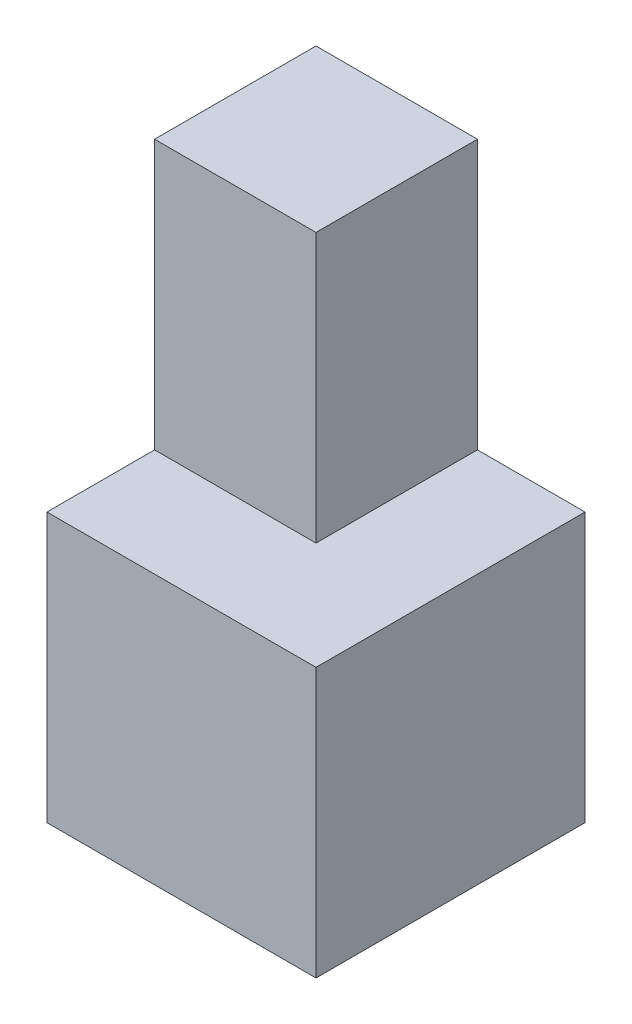
ISO-10303-21;
HEADER;
FILE_DESCRIPTION(('STEP AP214'),'2;1');
FILE_NAME('part.step','',(''),(''),'','','');
FILE_SCHEMA(('AUTOMOTIVE_DESIGN { 1 0 10303 214 1 1 1 1 }'));
ENDSEC;
DATA;
#1=APPLICATION_CONTEXT('core data for automotive mechanical design processes');
#2=APPLICATION_PROTOCOL_DEFINITION('international standard','automotive_design',2000,#1);
#3=PRODUCT_CONTEXT('',#1,'mechanical');
#4=PRODUCT('Part','Part','',(#3));
#5=PRODUCT_RELATED_PRODUCT_CATEGORY('part','',(#4));
#6=PRODUCT_DEFINITION_FORMATION('','',#4);
#7=PRODUCT_DEFINITION_CONTEXT('part definition',#1,'design');
#8=PRODUCT_DEFINITION('design','',#6,#7);
#9=PRODUCT_DEFINITION_SHAPE('','',#8);
#10=(LENGTH_UNIT() NAMED_UNIT(*) SI_UNIT(.MILLI.,.METRE.));
#11=(NAMED_UNIT(*) PLANE_ANGLE_UNIT() SI_UNIT($,.RADIAN.));
#12=(NAMED_UNIT(*) SI_UNIT($,.STERADIAN.) SOLID_ANGLE_UNIT());
#13=UNCERTAINTY_MEASURE_WITH_UNIT(LENGTH_MEASURE(1.E-05),#10,'distance_accuracy_value','');
#14=(GEOMETRIC_REPRESENTATION_CONTEXT(3) GLOBAL_UNCERTAINTY_ASSIGNED_CONTEXT((#13)) GLOBAL_UNIT_ASSIGNED_CONTEXT((#10,
#11,#12)) REPRESENTATION_CONTEXT('',''));
#15=CARTESIAN_POINT('',(0.,0.,0.));
#16=DIRECTION('',(0.,0.,1.));
#17=DIRECTION('',(1.,0.,0.));
#18=AXIS2_PLACEMENT_3D('',#15,#16,#17);
#19=CARTESIAN_POINT('',(0.,0.,0.));
#20=DIRECTION('',(0.,1.,0.));
#21=DIRECTION('',(0.,0.,1.));
#22=AXIS2_PLACEMENT_3D('',#19,#20,#21);
#23=PLANE('',#22);
#24=DIRECTION('',(1.,0.,0.));
#25=VECTOR('',#24,1.);
#26=CARTESIAN_POINT('',(0.,0.,-800.));
#27=LINE('',#26,#25);
#28=CARTESIAN_POINT('',(-200.,0.,-800.));
#29=VERTEX_POINT('',#28);
#30=CARTESIAN_POINT('',(200.,0.,-800.));
#31=VERTEX_POINT('',#30);
#32=EDGE_CURVE('E58',#29,#31,#27,.T.);
#33=ORIENTED_EDGE('',*,*,#32,.F.);
#34=DIRECTION('',(0.,0.,1.));
#35=VECTOR('',#34,1.);
#36=CARTESIAN_POINT('',(-200.,0.,0.));
#37=LINE('',#36,#35);
#38=CARTESIAN_POINT('',(-200.,0.,-200.));
#39=VERTEX_POINT('',#38);
#40=EDGE_CURVE('E100',#29,#39,#37,.T.);
#41=ORIENTED_EDGE('',*,*,#40,.T.);
#42=DIRECTION('',(1.,0.,0.));
#43=VECTOR('',#42,1.);
#44=CARTESIAN_POINT('',(0.,0.,-200.));
#45=LINE('',#44,#43);
#46=CARTESIAN_POINT('',(-800.,0.,-200.));
#47=VERTEX_POINT('',#46);
#48=EDGE_CURVE('E52',#47,#39,#45,.T.);
#49=ORIENTED_EDGE('',*,*,#48,.F.);
#50=DIRECTION('',(0.,0.,1.));
#51=VECTOR('',#50,1.);
#52=CARTESIAN_POINT('',(-800.,0.,0.));
#53=LINE('',#52,#51);
#54=CARTESIAN_POINT('',(-800.,0.,200.));
#55=VERTEX_POINT('',#54);
#56=EDGE_CURVE('E139',#47,#55,#53,.T.);
#57=ORIENTED_EDGE('',*,*,#56,.T.);
#58=DIRECTION('',(1.,0.,0.));
#59=VECTOR('',#58,1.);
#60=CARTESIAN_POINT('',(0.,0.,200.));
#61=LINE('',#60,#59);
#62=CARTESIAN_POINT('',(200.,0.,200.));
#63=VERTEX_POINT('',#62);
#64=EDGE_CURVE('E141',#55,#63,#61,.T.);
#65=ORIENTED_EDGE('',*,*,#64,.T.);
#66=DIRECTION('',(0.,0.,1.));
#67=VECTOR('',#66,1.);
#68=CARTESIAN_POINT('',(200.,0.,0.));
#69=LINE('',#68,#67);
#70=EDGE_CURVE('E130',#31,#63,#69,.T.);
#71=ORIENTED_EDGE('',*,*,#70,.F.);
#72=EDGE_LOOP('',(#33,#41,#49,#57,#65,#71));
#73=FACE_BOUND('',#72,.T.);
#74=ADVANCED_FACE('F35',(#73),#23,.T.);
#75=CARTESIAN_POINT('',(0.,-1000.,-800.));
#76=DIRECTION('',(0.,0.,1.));
#77=DIRECTION('',(1.,0.,0.));
#78=AXIS2_PLACEMENT_3D('',#75,#76,#77);
#79=PLANE('',#78);
#80=DIRECTION('',(0.,1.,0.));
#81=VECTOR('',#80,1.);
#82=CARTESIAN_POINT('',(-800.,-1000.,-800.));
#83=LINE('',#82,#81);
#84=CARTESIAN_POINT('',(-800.,-1000.,-800.));
#85=VERTEX_POINT('',#84);
#86=CARTESIAN_POINT('',(-800.,1000.,-800.));
#87=VERTEX_POINT('',#86);
#88=EDGE_CURVE('E39',#85,#87,#83,.T.);
#89=ORIENTED_EDGE('',*,*,#88,.T.);
#90=DIRECTION('',(1.,0.,0.));
#91=VECTOR('',#90,1.);
#92=CARTESIAN_POINT('',(0.,1000.,-800.));
#93=LINE('',#92,#91);
#94=CARTESIAN_POINT('',(-200.,1000.,-800.));
#95=VERTEX_POINT('',#94);
#96=EDGE_CURVE('E108',#87,#95,#93,.T.);
#97=ORIENTED_EDGE('',*,*,#96,.T.);
#98=DIRECTION('',(0.,-1.,0.));
#99=VECTOR('',#98,1.);
#100=CARTESIAN_POINT('',(-200.,1000.,-800.));
#101=LINE('',#100,#99);
#102=EDGE_CURVE('E95',#95,#29,#101,.T.);
#103=ORIENTED_EDGE('',*,*,#102,.T.);
#104=ORIENTED_EDGE('',*,*,#32,.T.);
#105=DIRECTION('',(0.,1.,0.));
#106=VECTOR('',#105,1.);
#107=CARTESIAN_POINT('',(200.,-1000.,-800.));
#108=LINE('',#107,#106);
#109=CARTESIAN_POINT('',(200.,-1000.,-800.));
#110=VERTEX_POINT('',#109);
#111=EDGE_CURVE('E11',#110,#31,#108,.T.);
#112=ORIENTED_EDGE('',*,*,#111,.F.);
#113=DIRECTION('',(1.,0.,0.));
#114=VECTOR('',#113,1.);
#115=CARTESIAN_POINT('',(0.,-1000.,-800.));
#116=LINE('',#115,#114);
#117=EDGE_CURVE('E126',#85,#110,#116,.T.);
#118=ORIENTED_EDGE('',*,*,#117,.F.);
#119=EDGE_LOOP('',(#89,#97,#103,#104,#112,#118));
#120=FACE_BOUND('',#119,.T.);
#121=ADVANCED_FACE('F37',(#120),#79,.F.);
#122=CARTESIAN_POINT('',(200.,-1000.,0.));
#123=DIRECTION('',(-1.,0.,0.));
#124=DIRECTION('',(0.,0.,1.));
#125=AXIS2_PLACEMENT_3D('',#122,#123,#124);
#126=PLANE('',#125);
#127=ORIENTED_EDGE('',*,*,#70,.T.);
#128=DIRECTION('',(0.,1.,0.));
#129=VECTOR('',#128,1.);
#130=CARTESIAN_POINT('',(200.,-1000.,200.));
#131=LINE('',#130,#129);
#132=CARTESIAN_POINT('',(200.,-1000.,200.));
#133=VERTEX_POINT('',#132);
#134=EDGE_CURVE('E44',#133,#63,#131,.T.);
#135=ORIENTED_EDGE('',*,*,#134,.F.);
#136=DIRECTION('',(0.,0.,1.));
#137=VECTOR('',#136,1.);
#138=CARTESIAN_POINT('',(200.,-1000.,0.));
#139=LINE('',#138,#137);
#140=EDGE_CURVE('E136',#110,#133,#139,.T.);
#141=ORIENTED_EDGE('',*,*,#140,.F.);
#142=ORIENTED_EDGE('',*,*,#111,.T.);
#143=EDGE_LOOP('',(#127,#135,#141,#142));
#144=FACE_BOUND('',#143,.T.);
#145=ADVANCED_FACE('F159',(#144),#126,.F.);
#146=CARTESIAN_POINT('',(0.,-1000.,200.));
#147=DIRECTION('',(0.,0.,1.));
#148=DIRECTION('',(1.,0.,0.));
#149=AXIS2_PLACEMENT_3D('',#146,#147,#148);
#150=PLANE('',#149);
#151=ORIENTED_EDGE('',*,*,#64,.F.);
#152=DIRECTION('',(0.,1.,0.));
#153=VECTOR('',#152,1.);
#154=CARTESIAN_POINT('',(-800.,-1000.,200.));
#155=LINE('',#154,#153);
#156=CARTESIAN_POINT('',(-800.,-1000.,200.));
#157=VERTEX_POINT('',#156);
#158=EDGE_CURVE('E146',#157,#55,#155,.T.);
#159=ORIENTED_EDGE('',*,*,#158,.F.);
#160=DIRECTION('',(1.,0.,0.));
#161=VECTOR('',#160,1.);
#162=CARTESIAN_POINT('',(0.,-1000.,200.));
#163=LINE('',#162,#161);
#164=EDGE_CURVE('E133',#157,#133,#163,.T.);
#165=ORIENTED_EDGE('',*,*,#164,.T.);
#166=ORIENTED_EDGE('',*,*,#134,.T.);
#167=EDGE_LOOP('',(#151,#159,#165,#166));
#168=FACE_BOUND('',#167,.T.);
#169=ADVANCED_FACE('F155',(#168),#150,.T.);
#170=CARTESIAN_POINT('',(-800.,-1000.,0.));
#171=DIRECTION('',(-1.,0.,0.));
#172=DIRECTION('',(0.,0.,1.));
#173=AXIS2_PLACEMENT_3D('',#170,#171,#172);
#174=PLANE('',#173);
#175=ORIENTED_EDGE('',*,*,#56,.F.);
#176=DIRECTION('',(0.,-1.,0.));
#177=VECTOR('',#176,1.);
#178=CARTESIAN_POINT('',(-800.,1000.,-200.));
#179=LINE('',#178,#177);
#180=CARTESIAN_POINT('',(-800.,1000.,-200.));
#181=VERTEX_POINT('',#180);
#182=EDGE_CURVE('E103',#181,#47,#179,.T.);
#183=ORIENTED_EDGE('',*,*,#182,.F.);
#184=DIRECTION('',(0.,0.,1.));
#185=VECTOR('',#184,1.);
#186=CARTESIAN_POINT('',(-800.,1000.,0.));
#187=LINE('',#186,#185);
#188=EDGE_CURVE('E115',#87,#181,#187,.T.);
#189=ORIENTED_EDGE('',*,*,#188,.F.);
#190=ORIENTED_EDGE('',*,*,#88,.F.);
#191=DIRECTION('',(0.,0.,1.));
#192=VECTOR('',#191,1.);
#193=CARTESIAN_POINT('',(-800.,-1000.,0.));
#194=LINE('',#193,#192);
#195=EDGE_CURVE('E129',#85,#157,#194,.T.);
#196=ORIENTED_EDGE('',*,*,#195,.T.);
#197=ORIENTED_EDGE('',*,*,#158,.T.);
#198=EDGE_LOOP('',(#175,#183,#189,#190,#196,#197));
#199=FACE_BOUND('',#198,.T.);
#200=ADVANCED_FACE('F150',(#199),#174,.T.);
#201=CARTESIAN_POINT('',(0.,-1000.,0.));
#202=DIRECTION('',(0.,1.,0.));
#203=DIRECTION('',(0.,0.,1.));
#204=AXIS2_PLACEMENT_3D('',#201,#202,#203);
#205=PLANE('',#204);
#206=ORIENTED_EDGE('',*,*,#117,.T.);
#207=ORIENTED_EDGE('',*,*,#140,.T.);
#208=ORIENTED_EDGE('',*,*,#164,.F.);
#209=ORIENTED_EDGE('',*,*,#195,.F.);
#210=EDGE_LOOP('',(#206,#207,#208,#209));
#211=FACE_BOUND('',#210,.T.);
#212=ADVANCED_FACE('F161',(#211),#205,.F.);
#213=CARTESIAN_POINT('',(-200.,1000.,0.));
#214=DIRECTION('',(1.,0.,0.));
#215=DIRECTION('',(0.,0.,-1.));
#216=AXIS2_PLACEMENT_3D('',#213,#214,#215);
#217=PLANE('',#216);
#218=ORIENTED_EDGE('',*,*,#40,.F.);
#219=ORIENTED_EDGE('',*,*,#102,.F.);
#220=DIRECTION('',(0.,0.,1.));
#221=VECTOR('',#220,1.);
#222=CARTESIAN_POINT('',(-200.,1000.,0.));
#223=LINE('',#222,#221);
#224=CARTESIAN_POINT('',(-200.,1000.,-200.));
#225=VERTEX_POINT('',#224);
#226=EDGE_CURVE('E99',#95,#225,#223,.T.);
#227=ORIENTED_EDGE('',*,*,#226,.T.);
#228=DIRECTION('',(0.,-1.,0.));
#229=VECTOR('',#228,1.);
#230=CARTESIAN_POINT('',(-200.,1000.,-200.));
#231=LINE('',#230,#229);
#232=EDGE_CURVE('E120',#225,#39,#231,.T.);
#233=ORIENTED_EDGE('',*,*,#232,.T.);
#234=EDGE_LOOP('',(#218,#219,#227,#233));
#235=FACE_BOUND('',#234,.T.);
#236=ADVANCED_FACE('F97',(#235),#217,.T.);
#237=CARTESIAN_POINT('',(0.,1000.,-200.));
#238=DIRECTION('',(0.,0.,-1.));
#239=DIRECTION('',(-1.,0.,0.));
#240=AXIS2_PLACEMENT_3D('',#237,#238,#239);
#241=PLANE('',#240);
#242=ORIENTED_EDGE('',*,*,#48,.T.);
#243=ORIENTED_EDGE('',*,*,#232,.F.);
#244=DIRECTION('',(1.,0.,0.));
#245=VECTOR('',#244,1.);
#246=CARTESIAN_POINT('',(0.,1000.,-200.));
#247=LINE('',#246,#245);
#248=EDGE_CURVE('E110',#181,#225,#247,.T.);
#249=ORIENTED_EDGE('',*,*,#248,.F.);
#250=ORIENTED_EDGE('',*,*,#182,.T.);
#251=EDGE_LOOP('',(#242,#243,#249,#250));
#252=FACE_BOUND('',#251,.T.);
#253=ADVANCED_FACE('F168',(#252),#241,.F.);
#254=CARTESIAN_POINT('',(0.,1000.,0.));
#255=DIRECTION('',(0.,1.,0.));
#256=DIRECTION('',(0.,0.,1.));
#257=AXIS2_PLACEMENT_3D('',#254,#255,#256);
#258=PLANE('',#257);
#259=ORIENTED_EDGE('',*,*,#226,.F.);
#260=ORIENTED_EDGE('',*,*,#96,.F.);
#261=ORIENTED_EDGE('',*,*,#188,.T.);
#262=ORIENTED_EDGE('',*,*,#248,.T.);
#263=EDGE_LOOP('',(#259,#260,#261,#262));
#264=FACE_BOUND('',#263,.T.);
#265=ADVANCED_FACE('F107',(#264),#258,.T.);
#266=CLOSED_SHELL('',(#74,#121,#145,#169,#200,#212,#236,#253,#265));
#267=MANIFOLD_SOLID_BREP('B2',#266);
#268=ADVANCED_BREP_SHAPE_REPRESENTATION('',(#18,#267),#14);
#269=SHAPE_DEFINITION_REPRESENTATION(#9,#268);
ENDSEC;
END-ISO-10303-21;
